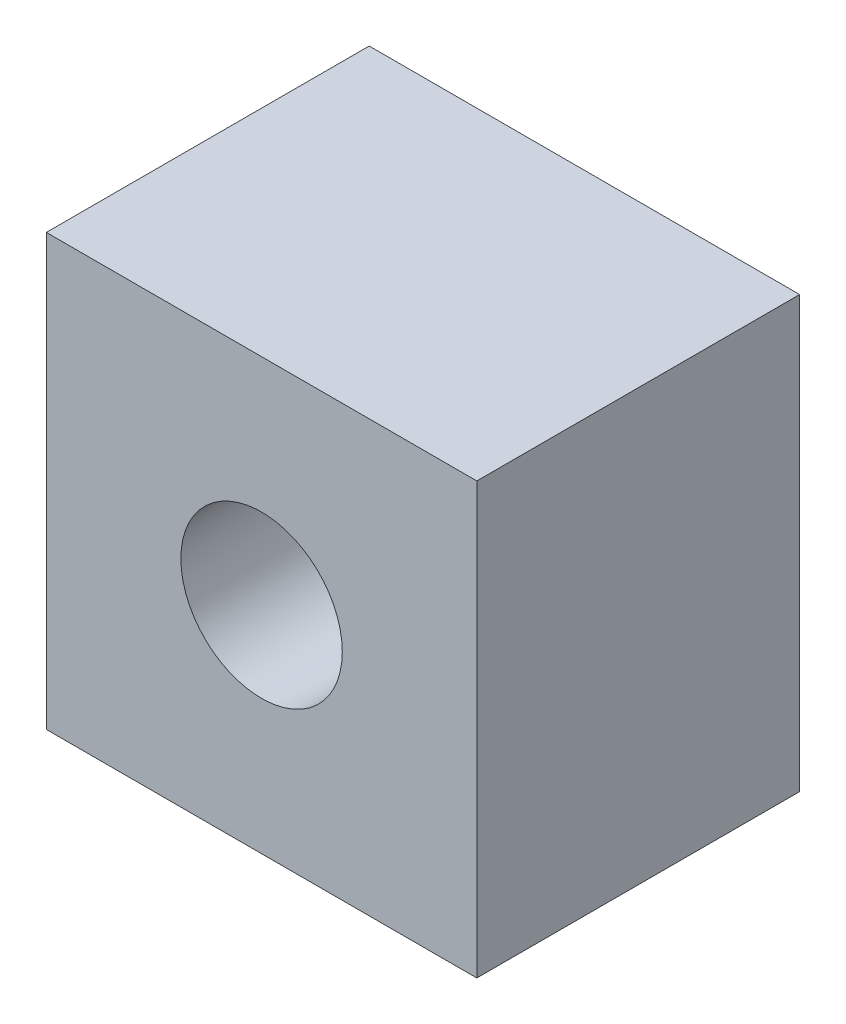
ISO-10303-21;
HEADER;
FILE_DESCRIPTION(('STEP AP214'),'2;1');
FILE_NAME('part.step','',(''),(''),'','','');
FILE_SCHEMA(('AUTOMOTIVE_DESIGN { 1 0 10303 214 1 1 1 1 }'));
ENDSEC;
DATA;
#1=APPLICATION_CONTEXT('core data for automotive mechanical design processes');
#2=APPLICATION_PROTOCOL_DEFINITION('international standard','automotive_design',2000,#1);
#3=PRODUCT_CONTEXT('',#1,'mechanical');
#4=PRODUCT('Part','Part','',(#3));
#5=PRODUCT_RELATED_PRODUCT_CATEGORY('part','',(#4));
#6=PRODUCT_DEFINITION_FORMATION('','',#4);
#7=PRODUCT_DEFINITION_CONTEXT('part definition',#1,'design');
#8=PRODUCT_DEFINITION('design','',#6,#7);
#9=PRODUCT_DEFINITION_SHAPE('','',#8);
#10=(LENGTH_UNIT() NAMED_UNIT(*) SI_UNIT(.MILLI.,.METRE.));
#11=(NAMED_UNIT(*) PLANE_ANGLE_UNIT() SI_UNIT($,.RADIAN.));
#12=(NAMED_UNIT(*) SI_UNIT($,.STERADIAN.) SOLID_ANGLE_UNIT());
#13=UNCERTAINTY_MEASURE_WITH_UNIT(LENGTH_MEASURE(1.E-05),#10,'distance_accuracy_value','');
#14=(GEOMETRIC_REPRESENTATION_CONTEXT(3) GLOBAL_UNCERTAINTY_ASSIGNED_CONTEXT((#13)) GLOBAL_UNIT_ASSIGNED_CONTEXT((#10,
#11,#12)) REPRESENTATION_CONTEXT('',''));
#15=CARTESIAN_POINT('',(0.,0.,0.));
#16=DIRECTION('',(0.,0.,1.));
#17=DIRECTION('',(1.,0.,0.));
#18=AXIS2_PLACEMENT_3D('',#15,#16,#17);
#19=CARTESIAN_POINT('',(0.,0.,30.));
#20=DIRECTION('',(1.,0.,0.));
#21=DIRECTION('',(0.,0.,-1.));
#22=AXIS2_PLACEMENT_3D('',#19,#20,#21);
#23=PLANE('',#22);
#24=DIRECTION('',(0.,-1.,0.));
#25=VECTOR('',#24,1.);
#26=CARTESIAN_POINT('',(0.,0.,0.));
#27=LINE('',#26,#25);
#28=CARTESIAN_POINT('',(0.,0.,0.));
#29=VERTEX_POINT('',#28);
#30=CARTESIAN_POINT('',(0.,-40.,0.));
#31=VERTEX_POINT('',#30);
#32=EDGE_CURVE('E96',#29,#31,#27,.T.);
#33=ORIENTED_EDGE('',*,*,#32,.T.);
#34=DIRECTION('',(0.,0.,-1.));
#35=VECTOR('',#34,1.);
#36=CARTESIAN_POINT('',(0.,-40.,30.));
#37=LINE('',#36,#35);
#38=CARTESIAN_POINT('',(0.,-40.,30.));
#39=VERTEX_POINT('',#38);
#40=EDGE_CURVE('E11',#39,#31,#37,.T.);
#41=ORIENTED_EDGE('',*,*,#40,.F.);
#42=DIRECTION('',(0.,-1.,0.));
#43=VECTOR('',#42,1.);
#44=CARTESIAN_POINT('',(0.,0.,30.));
#45=LINE('',#44,#43);
#46=CARTESIAN_POINT('',(0.,0.,30.));
#47=VERTEX_POINT('',#46);
#48=EDGE_CURVE('E84',#47,#39,#45,.T.);
#49=ORIENTED_EDGE('',*,*,#48,.F.);
#50=DIRECTION('',(0.,0.,-1.));
#51=VECTOR('',#50,1.);
#52=CARTESIAN_POINT('',(0.,0.,30.));
#53=LINE('',#52,#51);
#54=EDGE_CURVE('E92',#47,#29,#53,.T.);
#55=ORIENTED_EDGE('',*,*,#54,.T.);
#56=EDGE_LOOP('',(#33,#41,#49,#55));
#57=FACE_BOUND('',#56,.T.);
#58=ADVANCED_FACE('F33',(#57),#23,.F.);
#59=CARTESIAN_POINT('',(0.,-40.,30.));
#60=DIRECTION('',(0.,1.,0.));
#61=DIRECTION('',(0.,0.,1.));
#62=AXIS2_PLACEMENT_3D('',#59,#60,#61);
#63=PLANE('',#62);
#64=DIRECTION('',(1.,0.,0.));
#65=VECTOR('',#64,1.);
#66=CARTESIAN_POINT('',(0.,-40.,0.));
#67=LINE('',#66,#65);
#68=CARTESIAN_POINT('',(40.,-40.,0.));
#69=VERTEX_POINT('',#68);
#70=EDGE_CURVE('E88',#31,#69,#67,.T.);
#71=ORIENTED_EDGE('',*,*,#70,.T.);
#72=DIRECTION('',(0.,0.,-1.));
#73=VECTOR('',#72,1.);
#74=CARTESIAN_POINT('',(40.,-40.,30.));
#75=LINE('',#74,#73);
#76=CARTESIAN_POINT('',(40.,-40.,30.));
#77=VERTEX_POINT('',#76);
#78=EDGE_CURVE('E41',#77,#69,#75,.T.);
#79=ORIENTED_EDGE('',*,*,#78,.F.);
#80=DIRECTION('',(1.,0.,0.));
#81=VECTOR('',#80,1.);
#82=CARTESIAN_POINT('',(0.,-40.,30.));
#83=LINE('',#82,#81);
#84=EDGE_CURVE('E79',#39,#77,#83,.T.);
#85=ORIENTED_EDGE('',*,*,#84,.F.);
#86=ORIENTED_EDGE('',*,*,#40,.T.);
#87=EDGE_LOOP('',(#71,#79,#85,#86));
#88=FACE_BOUND('',#87,.T.);
#89=ADVANCED_FACE('F87',(#88),#63,.F.);
#90=CARTESIAN_POINT('',(40.,0.,30.));
#91=DIRECTION('',(-1.,0.,0.));
#92=DIRECTION('',(0.,-1.,0.));
#93=AXIS2_PLACEMENT_3D('',#90,#91,#92);
#94=PLANE('',#93);
#95=DIRECTION('',(0.,1.,0.));
#96=VECTOR('',#95,1.);
#97=CARTESIAN_POINT('',(40.,0.,0.));
#98=LINE('',#97,#96);
#99=CARTESIAN_POINT('',(40.,0.,0.));
#100=VERTEX_POINT('',#99);
#101=EDGE_CURVE('E66',#69,#100,#98,.T.);
#102=ORIENTED_EDGE('',*,*,#101,.T.);
#103=DIRECTION('',(0.,0.,-1.));
#104=VECTOR('',#103,1.);
#105=CARTESIAN_POINT('',(40.,0.,30.));
#106=LINE('',#105,#104);
#107=CARTESIAN_POINT('',(40.,0.,30.));
#108=VERTEX_POINT('',#107);
#109=EDGE_CURVE('E89',#108,#100,#106,.T.);
#110=ORIENTED_EDGE('',*,*,#109,.F.);
#111=DIRECTION('',(0.,1.,0.));
#112=VECTOR('',#111,1.);
#113=CARTESIAN_POINT('',(40.,0.,30.));
#114=LINE('',#113,#112);
#115=EDGE_CURVE('E82',#77,#108,#114,.T.);
#116=ORIENTED_EDGE('',*,*,#115,.F.);
#117=ORIENTED_EDGE('',*,*,#78,.T.);
#118=EDGE_LOOP('',(#102,#110,#116,#117));
#119=FACE_BOUND('',#118,.T.);
#120=ADVANCED_FACE('F90',(#119),#94,.F.);
#121=CARTESIAN_POINT('',(0.,0.,30.));
#122=DIRECTION('',(0.,-1.,0.));
#123=DIRECTION('',(0.,0.,-1.));
#124=AXIS2_PLACEMENT_3D('',#121,#122,#123);
#125=PLANE('',#124);
#126=DIRECTION('',(-1.,0.,0.));
#127=VECTOR('',#126,1.);
#128=CARTESIAN_POINT('',(0.,0.,0.));
#129=LINE('',#128,#127);
#130=EDGE_CURVE('E72',#100,#29,#129,.T.);
#131=ORIENTED_EDGE('',*,*,#130,.T.);
#132=ORIENTED_EDGE('',*,*,#54,.F.);
#133=DIRECTION('',(-1.,0.,0.));
#134=VECTOR('',#133,1.);
#135=CARTESIAN_POINT('',(0.,0.,30.));
#136=LINE('',#135,#134);
#137=EDGE_CURVE('E49',#108,#47,#136,.T.);
#138=ORIENTED_EDGE('',*,*,#137,.F.);
#139=ORIENTED_EDGE('',*,*,#109,.T.);
#140=EDGE_LOOP('',(#131,#132,#138,#139));
#141=FACE_BOUND('',#140,.T.);
#142=ADVANCED_FACE('F104',(#141),#125,.F.);
#143=CARTESIAN_POINT('',(0.,0.,30.));
#144=DIRECTION('',(0.,0.,1.));
#145=DIRECTION('',(1.,0.,0.));
#146=AXIS2_PLACEMENT_3D('',#143,#144,#145);
#147=PLANE('',#146);
#148=CARTESIAN_POINT('',(20.,-20.,30.));
#149=DIRECTION('',(0.,0.,1.));
#150=DIRECTION('',(1.,0.,0.));
#151=AXIS2_PLACEMENT_3D('',#148,#149,#150);
#152=CIRCLE('',#151,7.5);
#153=CARTESIAN_POINT('',(27.5,-20.,30.));
#154=VERTEX_POINT('',#153);
#155=EDGE_CURVE('E112',#154,#154,#152,.T.);
#156=ORIENTED_EDGE('',*,*,#155,.F.);
#157=EDGE_LOOP('',(#156));
#158=FACE_BOUND('',#157,.T.);
#159=ORIENTED_EDGE('',*,*,#48,.T.);
#160=ORIENTED_EDGE('',*,*,#84,.T.);
#161=ORIENTED_EDGE('',*,*,#115,.T.);
#162=ORIENTED_EDGE('',*,*,#137,.T.);
#163=EDGE_LOOP('',(#159,#160,#161,#162));
#164=FACE_BOUND('',#163,.T.);
#165=ADVANCED_FACE('F80',(#158,#164),#147,.T.);
#166=CARTESIAN_POINT('',(0.,0.,0.));
#167=DIRECTION('',(0.,0.,1.));
#168=DIRECTION('',(1.,0.,0.));
#169=AXIS2_PLACEMENT_3D('',#166,#167,#168);
#170=PLANE('',#169);
#171=CARTESIAN_POINT('',(20.,-20.,0.));
#172=DIRECTION('',(0.,0.,1.));
#173=DIRECTION('',(1.,0.,0.));
#174=AXIS2_PLACEMENT_3D('',#171,#172,#173);
#175=CIRCLE('',#174,7.49999999999999);
#176=CARTESIAN_POINT('',(27.5,-20.,0.));
#177=VERTEX_POINT('',#176);
#178=EDGE_CURVE('E99',#177,#177,#175,.T.);
#179=ORIENTED_EDGE('',*,*,#178,.T.);
#180=EDGE_LOOP('',(#179));
#181=FACE_BOUND('',#180,.T.);
#182=ORIENTED_EDGE('',*,*,#32,.F.);
#183=ORIENTED_EDGE('',*,*,#130,.F.);
#184=ORIENTED_EDGE('',*,*,#101,.F.);
#185=ORIENTED_EDGE('',*,*,#70,.F.);
#186=EDGE_LOOP('',(#182,#183,#184,#185));
#187=FACE_BOUND('',#186,.T.);
#188=ADVANCED_FACE('F107',(#181,#187),#170,.F.);
#189=CARTESIAN_POINT('',(20.,-20.,30.));
#190=DIRECTION('',(0.,0.,1.));
#191=DIRECTION('',(1.,0.,0.));
#192=AXIS2_PLACEMENT_3D('',#189,#190,#191);
#193=CYLINDRICAL_SURFACE('',#192,7.49999999999999);
#194=ORIENTED_EDGE('',*,*,#178,.F.);
#195=EDGE_LOOP('',(#194));
#196=FACE_BOUND('',#195,.T.);
#197=ORIENTED_EDGE('',*,*,#155,.T.);
#198=EDGE_LOOP('',(#197));
#199=FACE_BOUND('',#198,.T.);
#200=ADVANCED_FACE('F116',(#196,#199),#193,.F.);
#201=CLOSED_SHELL('',(#58,#89,#120,#142,#165,#188,#200));
#202=MANIFOLD_SOLID_BREP('B2',#201);
#203=ADVANCED_BREP_SHAPE_REPRESENTATION('',(#18,#202),#14);
#204=SHAPE_DEFINITION_REPRESENTATION(#9,#203);
ENDSEC;
END-ISO-10303-21;
